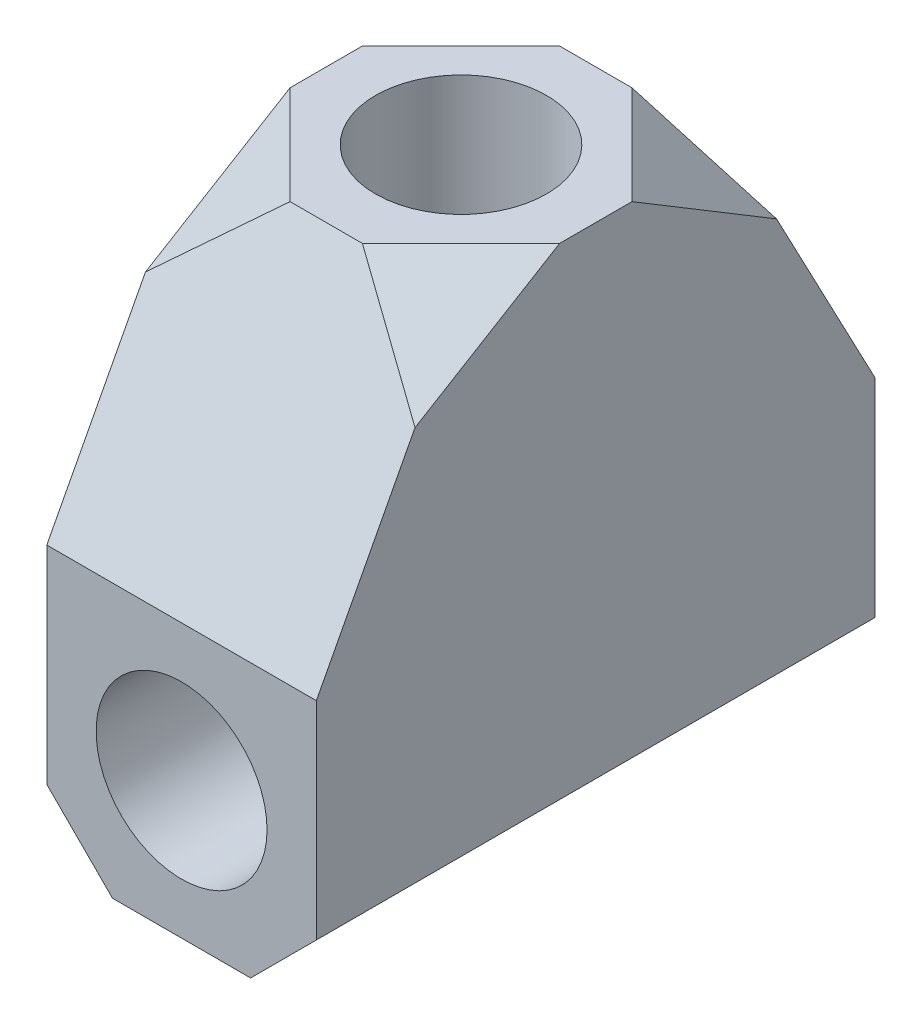
ISO-10303-21;
HEADER;
FILE_DESCRIPTION(('STEP AP214'),'2;1');
FILE_NAME('part.step','',(''),(''),'','','');
FILE_SCHEMA(('AUTOMOTIVE_DESIGN { 1 0 10303 214 1 1 1 1 }'));
ENDSEC;
DATA;
#1=APPLICATION_CONTEXT('core data for automotive mechanical design processes');
#2=APPLICATION_PROTOCOL_DEFINITION('international standard','automotive_design',2000,#1);
#3=PRODUCT_CONTEXT('',#1,'mechanical');
#4=PRODUCT('Part','Part','',(#3));
#5=PRODUCT_RELATED_PRODUCT_CATEGORY('part','',(#4));
#6=PRODUCT_DEFINITION_FORMATION('','',#4);
#7=PRODUCT_DEFINITION_CONTEXT('part definition',#1,'design');
#8=PRODUCT_DEFINITION('design','',#6,#7);
#9=PRODUCT_DEFINITION_SHAPE('','',#8);
#10=(LENGTH_UNIT() NAMED_UNIT(*) SI_UNIT(.MILLI.,.METRE.));
#11=(NAMED_UNIT(*) PLANE_ANGLE_UNIT() SI_UNIT($,.RADIAN.));
#12=(NAMED_UNIT(*) SI_UNIT($,.STERADIAN.) SOLID_ANGLE_UNIT());
#13=UNCERTAINTY_MEASURE_WITH_UNIT(LENGTH_MEASURE(1.E-05),#10,'distance_accuracy_value','');
#14=(GEOMETRIC_REPRESENTATION_CONTEXT(3) GLOBAL_UNCERTAINTY_ASSIGNED_CONTEXT((#13)) GLOBAL_UNIT_ASSIGNED_CONTEXT((#10,
#11,#12)) REPRESENTATION_CONTEXT('',''));
#15=CARTESIAN_POINT('',(0.,0.,0.));
#16=DIRECTION('',(0.,0.,1.));
#17=DIRECTION('',(1.,0.,0.));
#18=AXIS2_PLACEMENT_3D('',#15,#16,#17);
#19=CARTESIAN_POINT('',(8.2,-8.30596778551551,-17.));
#20=DIRECTION('',(1.,0.,0.));
#21=DIRECTION('',(0.,0.,-1.));
#22=AXIS2_PLACEMENT_3D('',#19,#20,#21);
#23=PLANE('',#22);
#24=DIRECTION('',(0.,0.884619549940972,0.466313469526919));
#25=VECTOR('',#24,1.);
#26=CARTESIAN_POINT('',(8.2,24.9999998891388,-8.20000001));
#27=LINE('',#26,#25);
#28=CARTESIAN_POINT('',(8.2,8.30596778551551,-17.));
#29=VERTEX_POINT('',#28);
#30=CARTESIAN_POINT('',(8.2,19.692282589493,-10.9978808271615));
#31=VERTEX_POINT('',#30);
#32=EDGE_CURVE('E128',#29,#31,#27,.T.);
#33=ORIENTED_EDGE('',*,*,#32,.T.);
#34=DIRECTION('',(0.,0.516568742024274,0.856245721019065));
#35=VECTOR('',#34,1.);
#36=CARTESIAN_POINT('',(8.2,9.5663420578313,-27.7822747445183));
#37=LINE('',#36,#35);
#38=CARTESIAN_POINT('',(8.2,24.9999998891389,-2.20000000999995));
#39=VERTEX_POINT('',#38);
#40=EDGE_CURVE('E11',#31,#39,#37,.T.);
#41=ORIENTED_EDGE('',*,*,#40,.T.);
#42=DIRECTION('',(0.,0.,1.));
#43=VECTOR('',#42,1.);
#44=CARTESIAN_POINT('',(8.2,24.9999998891388,8.20000001));
#45=LINE('',#44,#43);
#46=CARTESIAN_POINT('',(8.2,24.9999998891388,2.20000001000003));
#47=VERTEX_POINT('',#46);
#48=EDGE_CURVE('E136',#39,#47,#45,.T.);
#49=ORIENTED_EDGE('',*,*,#48,.T.);
#50=DIRECTION('',(0.,-0.516568742024274,0.856245721019065));
#51=VECTOR('',#50,1.);
#52=CARTESIAN_POINT('',(8.2,24.6048744068278,2.85494576256067));
#53=LINE('',#52,#51);
#54=CARTESIAN_POINT('',(8.2,19.692282589493,10.9978808271615));
#55=VERTEX_POINT('',#54);
#56=EDGE_CURVE('E218',#47,#55,#53,.T.);
#57=ORIENTED_EDGE('',*,*,#56,.T.);
#58=DIRECTION('',(0.,-0.884619549940972,0.466313469526919));
#59=VECTOR('',#58,1.);
#60=CARTESIAN_POINT('',(8.2,24.9999998891388,8.20000001));
#61=LINE('',#60,#59);
#62=CARTESIAN_POINT('',(8.2,8.30596778551551,17.));
#63=VERTEX_POINT('',#62);
#64=EDGE_CURVE('E139',#55,#63,#61,.T.);
#65=ORIENTED_EDGE('',*,*,#64,.T.);
#66=DIRECTION('',(0.,1.,0.));
#67=VECTOR('',#66,1.);
#68=CARTESIAN_POINT('',(8.2,-8.30596778551551,17.));
#69=LINE('',#68,#67);
#70=CARTESIAN_POINT('',(8.2,-4.30596778551551,17.));
#71=VERTEX_POINT('',#70);
#72=EDGE_CURVE('E167',#71,#63,#69,.T.);
#73=ORIENTED_EDGE('',*,*,#72,.F.);
#74=DIRECTION('',(0.,0.,-1.));
#75=VECTOR('',#74,1.);
#76=CARTESIAN_POINT('',(8.2,-4.30596778551551,-17.));
#77=LINE('',#76,#75);
#78=CARTESIAN_POINT('',(8.2,-4.30596778551551,-17.));
#79=VERTEX_POINT('',#78);
#80=EDGE_CURVE('E194',#71,#79,#77,.T.);
#81=ORIENTED_EDGE('',*,*,#80,.T.);
#82=DIRECTION('',(0.,1.,0.));
#83=VECTOR('',#82,1.);
#84=CARTESIAN_POINT('',(8.2,-8.30596778551551,-17.));
#85=LINE('',#84,#83);
#86=EDGE_CURVE('E135',#79,#29,#85,.T.);
#87=ORIENTED_EDGE('',*,*,#86,.T.);
#88=EDGE_LOOP('',(#33,#41,#49,#57,#65,#73,#81,#87));
#89=FACE_BOUND('',#88,.T.);
#90=ADVANCED_FACE('F34',(#89),#23,.T.);
#91=CARTESIAN_POINT('',(-8.2,24.9999998891388,8.20000001));
#92=DIRECTION('',(0.,1.,0.));
#93=DIRECTION('',(0.,0.,1.));
#94=AXIS2_PLACEMENT_3D('',#91,#92,#93);
#95=PLANE('',#94);
#96=CARTESIAN_POINT('',(0.,24.9999998891388,0.));
#97=DIRECTION('',(0.,1.,0.));
#98=DIRECTION('',(0.,0.,1.));
#99=AXIS2_PLACEMENT_3D('',#96,#97,#98);
#100=CIRCLE('',#99,5.2);
#101=CARTESIAN_POINT('',(0.,24.9999998891388,5.2));
#102=VERTEX_POINT('',#101);
#103=EDGE_CURVE('E142',#102,#102,#100,.T.);
#104=ORIENTED_EDGE('',*,*,#103,.F.);
#105=EDGE_LOOP('',(#104));
#106=FACE_BOUND('',#105,.T.);
#107=ORIENTED_EDGE('',*,*,#48,.F.);
#108=DIRECTION('',(-0.707106781186548,0.,-0.707106781186548));
#109=VECTOR('',#108,1.);
#110=CARTESIAN_POINT('',(5.20000001000001,24.9999998891388,-5.2));
#111=LINE('',#110,#109);
#112=CARTESIAN_POINT('',(2.20000000000001,24.9999998891388,-8.20000001));
#113=VERTEX_POINT('',#112);
#114=EDGE_CURVE('E42',#39,#113,#111,.T.);
#115=ORIENTED_EDGE('',*,*,#114,.T.);
#116=DIRECTION('',(1.,0.,0.));
#117=VECTOR('',#116,1.);
#118=CARTESIAN_POINT('',(-8.2,24.9999998891388,-8.20000001));
#119=LINE('',#118,#117);
#120=CARTESIAN_POINT('',(-2.20000000000001,24.9999998891388,-8.20000001));
#121=VERTEX_POINT('',#120);
#122=EDGE_CURVE('E131',#121,#113,#119,.T.);
#123=ORIENTED_EDGE('',*,*,#122,.F.);
#124=DIRECTION('',(-0.707106781186548,0.,0.707106781186548));
#125=VECTOR('',#124,1.);
#126=CARTESIAN_POINT('',(-13.40000001,24.9999998891388,2.99999999999999));
#127=LINE('',#126,#125);
#128=CARTESIAN_POINT('',(-8.2,24.9999998891389,-2.20000000999995));
#129=VERTEX_POINT('',#128);
#130=EDGE_CURVE('E55',#121,#129,#127,.T.);
#131=ORIENTED_EDGE('',*,*,#130,.T.);
#132=DIRECTION('',(0.,0.,1.));
#133=VECTOR('',#132,1.);
#134=CARTESIAN_POINT('',(-8.2,24.9999998891388,8.20000001));
#135=LINE('',#134,#133);
#136=CARTESIAN_POINT('',(-8.2,24.9999998891388,2.20000001000001));
#137=VERTEX_POINT('',#136);
#138=EDGE_CURVE('E150',#129,#137,#135,.T.);
#139=ORIENTED_EDGE('',*,*,#138,.T.);
#140=DIRECTION('',(0.707106781186548,0.,0.707106781186548));
#141=VECTOR('',#140,1.);
#142=CARTESIAN_POINT('',(-5.20000000000001,24.9999998891388,5.20000001000001));
#143=LINE('',#142,#141);
#144=CARTESIAN_POINT('',(-2.20000000000001,24.9999998891388,8.20000001));
#145=VERTEX_POINT('',#144);
#146=EDGE_CURVE('E206',#137,#145,#143,.T.);
#147=ORIENTED_EDGE('',*,*,#146,.T.);
#148=DIRECTION('',(1.,0.,0.));
#149=VECTOR('',#148,1.);
#150=CARTESIAN_POINT('',(-8.2,24.9999998891388,8.20000001));
#151=LINE('',#150,#149);
#152=CARTESIAN_POINT('',(2.20000000000001,24.9999998891388,8.20000001));
#153=VERTEX_POINT('',#152);
#154=EDGE_CURVE('E154',#145,#153,#151,.T.);
#155=ORIENTED_EDGE('',*,*,#154,.T.);
#156=DIRECTION('',(0.707106781186548,0.,-0.707106781186548));
#157=VECTOR('',#156,1.);
#158=CARTESIAN_POINT('',(-2.99999999999999,24.9999998891388,13.40000001));
#159=LINE('',#158,#157);
#160=EDGE_CURVE('E215',#153,#47,#159,.T.);
#161=ORIENTED_EDGE('',*,*,#160,.T.);
#162=EDGE_LOOP('',(#107,#115,#123,#131,#139,#147,#155,#161));
#163=FACE_BOUND('',#162,.T.);
#164=ADVANCED_FACE('F226',(#106,#163),#95,.T.);
#165=CARTESIAN_POINT('',(-8.2,24.9999998891388,-8.20000001));
#166=DIRECTION('',(0.,0.466313469526919,-0.884619549940972));
#167=DIRECTION('',(0.,0.884619549940972,0.466313469526919));
#168=AXIS2_PLACEMENT_3D('',#165,#166,#167);
#169=PLANE('',#168);
#170=ORIENTED_EDGE('',*,*,#122,.T.);
#171=DIRECTION('',(0.707106781186547,-0.625520482533453,-0.329733416461111));
#172=VECTOR('',#171,1.);
#173=CARTESIAN_POINT('',(-2.99999999999999,29.6000215488319,-5.77516996846002));
#174=LINE('',#173,#172);
#175=EDGE_CURVE('E120',#113,#31,#174,.T.);
#176=ORIENTED_EDGE('',*,*,#175,.T.);
#177=ORIENTED_EDGE('',*,*,#32,.F.);
#178=DIRECTION('',(-1.,0.,0.));
#179=VECTOR('',#178,1.);
#180=CARTESIAN_POINT('',(8.2,8.30596778551552,-17.));
#181=LINE('',#180,#179);
#182=CARTESIAN_POINT('',(-8.2,8.30596778551551,-17.));
#183=VERTEX_POINT('',#182);
#184=EDGE_CURVE('E183',#29,#183,#181,.T.);
#185=ORIENTED_EDGE('',*,*,#184,.T.);
#186=DIRECTION('',(0.,0.884619549940972,0.466313469526919));
#187=VECTOR('',#186,1.);
#188=CARTESIAN_POINT('',(-8.2,24.9999998891388,-8.20000001));
#189=LINE('',#188,#187);
#190=CARTESIAN_POINT('',(-8.2,19.692282589493,-10.9978808271615));
#191=VERTEX_POINT('',#190);
#192=EDGE_CURVE('E147',#183,#191,#189,.T.);
#193=ORIENTED_EDGE('',*,*,#192,.T.);
#194=DIRECTION('',(0.707106781186547,0.625520482533453,0.329733416461111));
#195=VECTOR('',#194,1.);
#196=CARTESIAN_POINT('',(-5.2,22.3461412393159,-9.59894041858075));
#197=LINE('',#196,#195);
#198=EDGE_CURVE('E132',#191,#121,#197,.T.);
#199=ORIENTED_EDGE('',*,*,#198,.T.);
#200=EDGE_LOOP('',(#170,#176,#177,#185,#193,#199));
#201=FACE_BOUND('',#200,.T.);
#202=ADVANCED_FACE('F127',(#201),#169,.T.);
#203=CARTESIAN_POINT('',(-8.2,-8.30596778551551,-17.));
#204=DIRECTION('',(-1.,0.,0.));
#205=DIRECTION('',(0.,0.,1.));
#206=AXIS2_PLACEMENT_3D('',#203,#204,#205);
#207=PLANE('',#206);
#208=CARTESIAN_POINT('',(-8.2,12.1338713093966,10.4604622138169));
#209=DIRECTION('',(1.,0.,0.));
#210=DIRECTION('',(0.,0.,-1.));
#211=AXIS2_PLACEMENT_3D('',#208,#209,#210);
#212=CIRCLE('',#211,1.83);
#213=CARTESIAN_POINT('',(-8.2,12.1338713093966,8.63046221381687));
#214=VERTEX_POINT('',#213);
#215=EDGE_CURVE('E363',#214,#214,#212,.T.);
#216=ORIENTED_EDGE('',*,*,#215,.T.);
#217=EDGE_LOOP('',(#216));
#218=FACE_BOUND('',#217,.T.);
#219=CARTESIAN_POINT('',(-8.2,12.1338713093966,-10.4604622138168));
#220=DIRECTION('',(1.,0.,0.));
#221=DIRECTION('',(0.,0.,1.));
#222=AXIS2_PLACEMENT_3D('',#219,#220,#221);
#223=CIRCLE('',#222,1.83);
#224=CARTESIAN_POINT('',(-8.2,12.1338713093966,-8.63046221381682));
#225=VERTEX_POINT('',#224);
#226=EDGE_CURVE('E372',#225,#225,#223,.T.);
#227=ORIENTED_EDGE('',*,*,#226,.T.);
#228=EDGE_LOOP('',(#227));
#229=FACE_BOUND('',#228,.T.);
#230=ORIENTED_EDGE('',*,*,#138,.F.);
#231=DIRECTION('',(0.,-0.516568742024274,-0.856245721019065));
#232=VECTOR('',#231,1.);
#233=CARTESIAN_POINT('',(-8.2,9.5663420578313,-27.7822747445183));
#234=LINE('',#233,#232);
#235=EDGE_CURVE('E222',#129,#191,#234,.T.);
#236=ORIENTED_EDGE('',*,*,#235,.T.);
#237=ORIENTED_EDGE('',*,*,#192,.F.);
#238=DIRECTION('',(0.,-1.,0.));
#239=VECTOR('',#238,1.);
#240=CARTESIAN_POINT('',(-8.2,-8.30596778551551,-17.));
#241=LINE('',#240,#239);
#242=CARTESIAN_POINT('',(-8.2,-4.30596778551551,-17.));
#243=VERTEX_POINT('',#242);
#244=EDGE_CURVE('E176',#183,#243,#241,.T.);
#245=ORIENTED_EDGE('',*,*,#244,.T.);
#246=DIRECTION('',(0.,0.,1.));
#247=VECTOR('',#246,1.);
#248=CARTESIAN_POINT('',(-8.2,-4.30596778551551,-17.));
#249=LINE('',#248,#247);
#250=CARTESIAN_POINT('',(-8.2,-4.30596778551551,17.));
#251=VERTEX_POINT('',#250);
#252=EDGE_CURVE('E200',#243,#251,#249,.T.);
#253=ORIENTED_EDGE('',*,*,#252,.T.);
#254=DIRECTION('',(0.,-1.,0.));
#255=VECTOR('',#254,1.);
#256=CARTESIAN_POINT('',(-8.2,-8.30596778551551,17.));
#257=LINE('',#256,#255);
#258=CARTESIAN_POINT('',(-8.2,8.30596778551551,17.));
#259=VERTEX_POINT('',#258);
#260=EDGE_CURVE('E161',#259,#251,#257,.T.);
#261=ORIENTED_EDGE('',*,*,#260,.F.);
#262=DIRECTION('',(0.,-0.884619549940972,0.466313469526919));
#263=VECTOR('',#262,1.);
#264=CARTESIAN_POINT('',(-8.2,24.9999998891388,8.20000001));
#265=LINE('',#264,#263);
#266=CARTESIAN_POINT('',(-8.2,19.692282589493,10.9978808271615));
#267=VERTEX_POINT('',#266);
#268=EDGE_CURVE('E152',#267,#259,#265,.T.);
#269=ORIENTED_EDGE('',*,*,#268,.F.);
#270=DIRECTION('',(0.,0.516568742024274,-0.856245721019065));
#271=VECTOR('',#270,1.);
#272=CARTESIAN_POINT('',(-8.2,24.6048744068278,2.85494576256067));
#273=LINE('',#272,#271);
#274=EDGE_CURVE('E203',#267,#137,#273,.T.);
#275=ORIENTED_EDGE('',*,*,#274,.T.);
#276=EDGE_LOOP('',(#230,#236,#237,#245,#253,#261,#269,#275));
#277=FACE_BOUND('',#276,.T.);
#278=ADVANCED_FACE('F241',(#218,#229,#277),#207,.T.);
#279=CARTESIAN_POINT('',(-8.2,24.9999998891388,8.20000001));
#280=DIRECTION('',(0.,0.466313469526919,0.884619549940972));
#281=DIRECTION('',(0.,-0.884619549940972,0.466313469526919));
#282=AXIS2_PLACEMENT_3D('',#279,#280,#281);
#283=PLANE('',#282);
#284=ORIENTED_EDGE('',*,*,#64,.F.);
#285=DIRECTION('',(-0.707106781186547,0.625520482533453,-0.329733416461111));
#286=VECTOR('',#285,1.);
#287=CARTESIAN_POINT('',(-2.99999999999999,29.6000215488319,5.77516996846002));
#288=LINE('',#287,#286);
#289=EDGE_CURVE('E212',#55,#153,#288,.T.);
#290=ORIENTED_EDGE('',*,*,#289,.T.);
#291=ORIENTED_EDGE('',*,*,#154,.F.);
#292=DIRECTION('',(-0.707106781186547,-0.625520482533453,0.329733416461111));
#293=VECTOR('',#292,1.);
#294=CARTESIAN_POINT('',(-5.2,22.3461412393159,9.59894041858075));
#295=LINE('',#294,#293);
#296=EDGE_CURVE('E209',#145,#267,#295,.T.);
#297=ORIENTED_EDGE('',*,*,#296,.T.);
#298=ORIENTED_EDGE('',*,*,#268,.T.);
#299=DIRECTION('',(-1.,0.,0.));
#300=VECTOR('',#299,1.);
#301=CARTESIAN_POINT('',(8.2,8.30596778551552,17.));
#302=LINE('',#301,#300);
#303=EDGE_CURVE('E170',#63,#259,#302,.T.);
#304=ORIENTED_EDGE('',*,*,#303,.F.);
#305=EDGE_LOOP('',(#284,#290,#291,#297,#298,#304));
#306=FACE_BOUND('',#305,.T.);
#307=ADVANCED_FACE('F233',(#306),#283,.T.);
#308=CARTESIAN_POINT('',(8.2,-8.30596778551551,-17.));
#309=DIRECTION('',(0.,-1.,0.));
#310=DIRECTION('',(1.,0.,0.));
#311=AXIS2_PLACEMENT_3D('',#308,#309,#310);
#312=PLANE('',#311);
#313=DIRECTION('',(1.,0.,0.));
#314=VECTOR('',#313,1.);
#315=CARTESIAN_POINT('',(8.2,-8.30596778551551,-17.));
#316=LINE('',#315,#314);
#317=CARTESIAN_POINT('',(-4.19999999999999,-8.30596778551551,-17.));
#318=VERTEX_POINT('',#317);
#319=CARTESIAN_POINT('',(4.20000000000001,-8.30596778551551,-17.));
#320=VERTEX_POINT('',#319);
#321=EDGE_CURVE('E179',#318,#320,#316,.T.);
#322=ORIENTED_EDGE('',*,*,#321,.T.);
#323=DIRECTION('',(0.,0.,1.));
#324=VECTOR('',#323,1.);
#325=CARTESIAN_POINT('',(4.20000000000001,-8.30596778551551,-17.));
#326=LINE('',#325,#324);
#327=CARTESIAN_POINT('',(4.20000000000001,-8.30596778551551,17.));
#328=VERTEX_POINT('',#327);
#329=EDGE_CURVE('E187',#320,#328,#326,.T.);
#330=ORIENTED_EDGE('',*,*,#329,.T.);
#331=DIRECTION('',(1.,0.,0.));
#332=VECTOR('',#331,1.);
#333=CARTESIAN_POINT('',(8.2,-8.30596778551551,17.));
#334=LINE('',#333,#332);
#335=CARTESIAN_POINT('',(-4.19999999999999,-8.30596778551551,17.));
#336=VERTEX_POINT('',#335);
#337=EDGE_CURVE('E164',#336,#328,#334,.T.);
#338=ORIENTED_EDGE('',*,*,#337,.F.);
#339=DIRECTION('',(0.,0.,-1.));
#340=VECTOR('',#339,1.);
#341=CARTESIAN_POINT('',(-4.19999999999999,-8.30596778551551,-17.));
#342=LINE('',#341,#340);
#343=EDGE_CURVE('E185',#336,#318,#342,.T.);
#344=ORIENTED_EDGE('',*,*,#343,.T.);
#345=EDGE_LOOP('',(#322,#330,#338,#344));
#346=FACE_BOUND('',#345,.T.);
#347=ADVANCED_FACE('F256',(#346),#312,.T.);
#348=CARTESIAN_POINT('',(0.,0.,-17.));
#349=DIRECTION('',(0.,0.,1.));
#350=DIRECTION('',(1.,0.,0.));
#351=AXIS2_PLACEMENT_3D('',#348,#349,#350);
#352=PLANE('',#351);
#353=CARTESIAN_POINT('',(0.,0.,-17.));
#354=DIRECTION('',(0.,0.,1.));
#355=DIRECTION('',(1.,0.,0.));
#356=AXIS2_PLACEMENT_3D('',#353,#354,#355);
#357=CIRCLE('',#356,5.2);
#358=CARTESIAN_POINT('',(5.2,0.,-17.));
#359=VERTEX_POINT('',#358);
#360=EDGE_CURVE('E173',#359,#359,#357,.T.);
#361=ORIENTED_EDGE('',*,*,#360,.T.);
#362=EDGE_LOOP('',(#361));
#363=FACE_BOUND('',#362,.T.);
#364=ORIENTED_EDGE('',*,*,#86,.F.);
#365=DIRECTION('',(0.707106781186546,0.707106781186549,0.));
#366=VECTOR('',#365,1.);
#367=CARTESIAN_POINT('',(4.20000000000001,-8.30596778551551,-17.));
#368=LINE('',#367,#366);
#369=EDGE_CURVE('E198',#79,#320,#368,.F.);
#370=ORIENTED_EDGE('',*,*,#369,.T.);
#371=ORIENTED_EDGE('',*,*,#321,.F.);
#372=DIRECTION('',(0.707106781186548,-0.707106781186547,0.));
#373=VECTOR('',#372,1.);
#374=CARTESIAN_POINT('',(-8.2,-4.30596778551551,-17.));
#375=LINE('',#374,#373);
#376=EDGE_CURVE('E196',#318,#243,#375,.F.);
#377=ORIENTED_EDGE('',*,*,#376,.T.);
#378=ORIENTED_EDGE('',*,*,#244,.F.);
#379=ORIENTED_EDGE('',*,*,#184,.F.);
#380=EDGE_LOOP('',(#364,#370,#371,#377,#378,#379));
#381=FACE_BOUND('',#380,.T.);
#382=ADVANCED_FACE('F253',(#363,#381),#352,.F.);
#383=CARTESIAN_POINT('',(0.,0.,-17.));
#384=DIRECTION('',(0.,0.,1.));
#385=DIRECTION('',(1.,0.,0.));
#386=AXIS2_PLACEMENT_3D('',#383,#384,#385);
#387=CYLINDRICAL_SURFACE('',#386,5.2);
#388=ORIENTED_EDGE('',*,*,#360,.F.);
#389=EDGE_LOOP('',(#388));
#390=FACE_BOUND('',#389,.T.);
#391=CARTESIAN_POINT('',(0.,0.,17.));
#392=DIRECTION('',(0.,0.,1.));
#393=DIRECTION('',(1.,0.,0.));
#394=AXIS2_PLACEMENT_3D('',#391,#392,#393);
#395=CIRCLE('',#394,5.2);
#396=CARTESIAN_POINT('',(5.2,0.,17.));
#397=VERTEX_POINT('',#396);
#398=EDGE_CURVE('E157',#397,#397,#395,.T.);
#399=ORIENTED_EDGE('',*,*,#398,.T.);
#400=EDGE_LOOP('',(#399));
#401=FACE_BOUND('',#400,.T.);
#402=ADVANCED_FACE('F308',(#390,#401),#387,.F.);
#403=CARTESIAN_POINT('',(0.,0.,17.));
#404=DIRECTION('',(0.,0.,1.));
#405=DIRECTION('',(1.,0.,0.));
#406=AXIS2_PLACEMENT_3D('',#403,#404,#405);
#407=PLANE('',#406);
#408=ORIENTED_EDGE('',*,*,#398,.F.);
#409=EDGE_LOOP('',(#408));
#410=FACE_BOUND('',#409,.T.);
#411=ORIENTED_EDGE('',*,*,#337,.T.);
#412=DIRECTION('',(-0.707106781186546,-0.707106781186549,0.));
#413=VECTOR('',#412,1.);
#414=CARTESIAN_POINT('',(6.25298389275777,-6.25298389275775,17.));
#415=LINE('',#414,#413);
#416=EDGE_CURVE('E192',#328,#71,#415,.F.);
#417=ORIENTED_EDGE('',*,*,#416,.T.);
#418=ORIENTED_EDGE('',*,*,#72,.T.);
#419=ORIENTED_EDGE('',*,*,#303,.T.);
#420=ORIENTED_EDGE('',*,*,#260,.T.);
#421=DIRECTION('',(-0.707106781186548,0.707106781186547,0.));
#422=VECTOR('',#421,1.);
#423=CARTESIAN_POINT('',(-6.25298389275775,-6.25298389275776,17.));
#424=LINE('',#423,#422);
#425=EDGE_CURVE('E190',#251,#336,#424,.F.);
#426=ORIENTED_EDGE('',*,*,#425,.T.);
#427=EDGE_LOOP('',(#411,#417,#418,#419,#420,#426));
#428=FACE_BOUND('',#427,.T.);
#429=ADVANCED_FACE('F244',(#410,#428),#407,.T.);
#430=CARTESIAN_POINT('',(0.,8.19999988913884,0.));
#431=DIRECTION('',(0.,1.,0.));
#432=DIRECTION('',(0.,0.,1.));
#433=AXIS2_PLACEMENT_3D('',#430,#431,#432);
#434=CYLINDRICAL_SURFACE('',#433,5.2);
#435=CARTESIAN_POINT('',(0.,8.19999988913884,0.));
#436=DIRECTION('',(0.,1.,0.));
#437=DIRECTION('',(0.,0.,1.));
#438=AXIS2_PLACEMENT_3D('',#435,#436,#437);
#439=CIRCLE('',#438,5.2);
#440=CARTESIAN_POINT('',(0.,8.19999988913884,5.2));
#441=VERTEX_POINT('',#440);
#442=EDGE_CURVE('E137',#441,#441,#439,.T.);
#443=ORIENTED_EDGE('',*,*,#442,.F.);
#444=EDGE_LOOP('',(#443));
#445=FACE_BOUND('',#444,.T.);
#446=ORIENTED_EDGE('',*,*,#103,.T.);
#447=EDGE_LOOP('',(#446));
#448=FACE_BOUND('',#447,.T.);
#449=ADVANCED_FACE('F293',(#445,#448),#434,.F.);
#450=CARTESIAN_POINT('',(0.,8.19999988913884,0.));
#451=DIRECTION('',(0.,1.,0.));
#452=DIRECTION('',(0.,0.,1.));
#453=AXIS2_PLACEMENT_3D('',#450,#451,#452);
#454=PLANE('',#453);
#455=ORIENTED_EDGE('',*,*,#442,.T.);
#456=EDGE_LOOP('',(#455));
#457=FACE_BOUND('',#456,.T.);
#458=ADVANCED_FACE('F288',(#457),#454,.T.);
#459=CARTESIAN_POINT('',(4.20000000000001,-8.30596778551551,-17.));
#460=DIRECTION('',(-0.707106781186549,0.707106781186546,0.));
#461=DIRECTION('',(0.,0.,1.));
#462=AXIS2_PLACEMENT_3D('',#459,#460,#461);
#463=PLANE('',#462);
#464=ORIENTED_EDGE('',*,*,#369,.F.);
#465=ORIENTED_EDGE('',*,*,#80,.F.);
#466=ORIENTED_EDGE('',*,*,#416,.F.);
#467=ORIENTED_EDGE('',*,*,#329,.F.);
#468=EDGE_LOOP('',(#464,#465,#466,#467));
#469=FACE_BOUND('',#468,.T.);
#470=ADVANCED_FACE('F249',(#469),#463,.F.);
#471=CARTESIAN_POINT('',(-8.2,-4.30596778551551,-17.));
#472=DIRECTION('',(0.707106781186547,0.707106781186548,0.));
#473=DIRECTION('',(0.,0.,1.));
#474=AXIS2_PLACEMENT_3D('',#471,#472,#473);
#475=PLANE('',#474);
#476=ORIENTED_EDGE('',*,*,#376,.F.);
#477=ORIENTED_EDGE('',*,*,#343,.F.);
#478=ORIENTED_EDGE('',*,*,#425,.F.);
#479=ORIENTED_EDGE('',*,*,#252,.F.);
#480=EDGE_LOOP('',(#476,#477,#478,#479));
#481=FACE_BOUND('',#480,.T.);
#482=ADVANCED_FACE('F36',(#481),#475,.F.);
#483=CARTESIAN_POINT('',(-10.9191994510645,18.0992712998658,10.9191994510645));
#484=DIRECTION('',(-0.458951379567178,0.760741258501712,0.458951379567178));
#485=DIRECTION('',(0.,-0.516568742024274,0.856245721019065));
#486=AXIS2_PLACEMENT_3D('',#483,#484,#485);
#487=PLANE('',#486);
#488=ORIENTED_EDGE('',*,*,#274,.F.);
#489=ORIENTED_EDGE('',*,*,#296,.F.);
#490=ORIENTED_EDGE('',*,*,#146,.F.);
#491=EDGE_LOOP('',(#488,#489,#490));
#492=FACE_BOUND('',#491,.T.);
#493=ADVANCED_FACE('F238',(#492),#487,.T.);
#494=CARTESIAN_POINT('',(10.9191994510645,18.0992712998658,10.9191994510645));
#495=DIRECTION('',(0.458951379567178,0.760741258501712,0.458951379567178));
#496=DIRECTION('',(0.,-0.516568742024274,0.856245721019065));
#497=AXIS2_PLACEMENT_3D('',#494,#495,#496);
#498=PLANE('',#497);
#499=ORIENTED_EDGE('',*,*,#289,.F.);
#500=ORIENTED_EDGE('',*,*,#56,.F.);
#501=ORIENTED_EDGE('',*,*,#160,.F.);
#502=EDGE_LOOP('',(#499,#500,#501));
#503=FACE_BOUND('',#502,.T.);
#504=ADVANCED_FACE('F230',(#503),#498,.T.);
#505=CARTESIAN_POINT('',(-10.9191994510645,18.0992712998658,-10.9191994510645));
#506=DIRECTION('',(-0.458951379567178,0.760741258501712,-0.458951379567178));
#507=DIRECTION('',(0.,0.516568742024274,0.856245721019065));
#508=AXIS2_PLACEMENT_3D('',#505,#506,#507);
#509=PLANE('',#508);
#510=ORIENTED_EDGE('',*,*,#130,.F.);
#511=ORIENTED_EDGE('',*,*,#198,.F.);
#512=ORIENTED_EDGE('',*,*,#235,.F.);
#513=EDGE_LOOP('',(#510,#511,#512));
#514=FACE_BOUND('',#513,.T.);
#515=ADVANCED_FACE('F263',(#514),#509,.T.);
#516=CARTESIAN_POINT('',(10.9191994510645,18.0992712998658,-10.9191994510645));
#517=DIRECTION('',(0.458951379567178,0.760741258501712,-0.458951379567178));
#518=DIRECTION('',(0.,0.516568742024274,0.856245721019065));
#519=AXIS2_PLACEMENT_3D('',#516,#517,#518);
#520=PLANE('',#519);
#521=ORIENTED_EDGE('',*,*,#175,.F.);
#522=ORIENTED_EDGE('',*,*,#114,.F.);
#523=ORIENTED_EDGE('',*,*,#40,.F.);
#524=EDGE_LOOP('',(#521,#522,#523));
#525=FACE_BOUND('',#524,.T.);
#526=ADVANCED_FACE('F119',(#525),#520,.T.);
#527=CARTESIAN_POINT('',(1.8,12.1338713093966,-10.4604622138168));
#528=DIRECTION('',(-1.,0.,0.));
#529=DIRECTION('',(0.,0.,1.));
#530=AXIS2_PLACEMENT_3D('',#527,#528,#529);
#531=CYLINDRICAL_SURFACE('',#530,1.83);
#532=CARTESIAN_POINT('',(1.8,12.1338713093966,-10.4604622138168));
#533=DIRECTION('',(1.,0.,0.));
#534=DIRECTION('',(0.,0.,1.));
#535=AXIS2_PLACEMENT_3D('',#532,#533,#534);
#536=CIRCLE('',#535,1.83);
#537=CARTESIAN_POINT('',(1.8,12.1338713093966,-8.63046221381682));
#538=VERTEX_POINT('',#537);
#539=EDGE_CURVE('E367',#538,#538,#536,.T.);
#540=ORIENTED_EDGE('',*,*,#539,.T.);
#541=EDGE_LOOP('',(#540));
#542=FACE_BOUND('',#541,.T.);
#543=ORIENTED_EDGE('',*,*,#226,.F.);
#544=EDGE_LOOP('',(#543));
#545=FACE_BOUND('',#544,.T.);
#546=ADVANCED_FACE('F269',(#542,#545),#531,.F.);
#547=CARTESIAN_POINT('',(1.8,12.1338713093966,-10.4604622138168));
#548=DIRECTION('',(-1.,0.,0.));
#549=DIRECTION('',(0.,0.,1.));
#550=AXIS2_PLACEMENT_3D('',#547,#548,#549);
#551=PLANE('',#550);
#552=ORIENTED_EDGE('',*,*,#539,.F.);
#553=EDGE_LOOP('',(#552));
#554=FACE_BOUND('',#553,.T.);
#555=ADVANCED_FACE('F333',(#554),#551,.T.);
#556=CARTESIAN_POINT('',(1.8,12.1338713093966,10.4604622138169));
#557=DIRECTION('',(-1.,0.,0.));
#558=DIRECTION('',(0.,0.,1.));
#559=AXIS2_PLACEMENT_3D('',#556,#557,#558);
#560=CYLINDRICAL_SURFACE('',#559,1.83);
#561=CARTESIAN_POINT('',(1.8,12.1338713093966,10.4604622138169));
#562=DIRECTION('',(1.,0.,0.));
#563=DIRECTION('',(0.,0.,-1.));
#564=AXIS2_PLACEMENT_3D('',#561,#562,#563);
#565=CIRCLE('',#564,1.83);
#566=CARTESIAN_POINT('',(1.8,12.1338713093966,8.63046221381687));
#567=VERTEX_POINT('',#566);
#568=EDGE_CURVE('E362',#567,#567,#565,.T.);
#569=ORIENTED_EDGE('',*,*,#568,.T.);
#570=EDGE_LOOP('',(#569));
#571=FACE_BOUND('',#570,.T.);
#572=ORIENTED_EDGE('',*,*,#215,.F.);
#573=EDGE_LOOP('',(#572));
#574=FACE_BOUND('',#573,.T.);
#575=ADVANCED_FACE('F341',(#571,#574),#560,.F.);
#576=CARTESIAN_POINT('',(1.8,12.1338713093966,10.4604622138169));
#577=DIRECTION('',(1.,0.,0.));
#578=DIRECTION('',(0.,0.,-1.));
#579=AXIS2_PLACEMENT_3D('',#576,#577,#578);
#580=PLANE('',#579);
#581=ORIENTED_EDGE('',*,*,#568,.F.);
#582=EDGE_LOOP('',(#581));
#583=FACE_BOUND('',#582,.T.);
#584=ADVANCED_FACE('F349',(#583),#580,.F.);
#585=CLOSED_SHELL('',(#90,#164,#202,#278,#307,#347,#382,#402,#429,#449,#458,#470,#482,#493,#504,
#515,#526,#546,#555,#575,#584));
#586=MANIFOLD_SOLID_BREP('B2',#585);
#587=ADVANCED_BREP_SHAPE_REPRESENTATION('',(#18,#586),#14);
#588=SHAPE_DEFINITION_REPRESENTATION(#9,#587);
ENDSEC;
END-ISO-10303-21;
